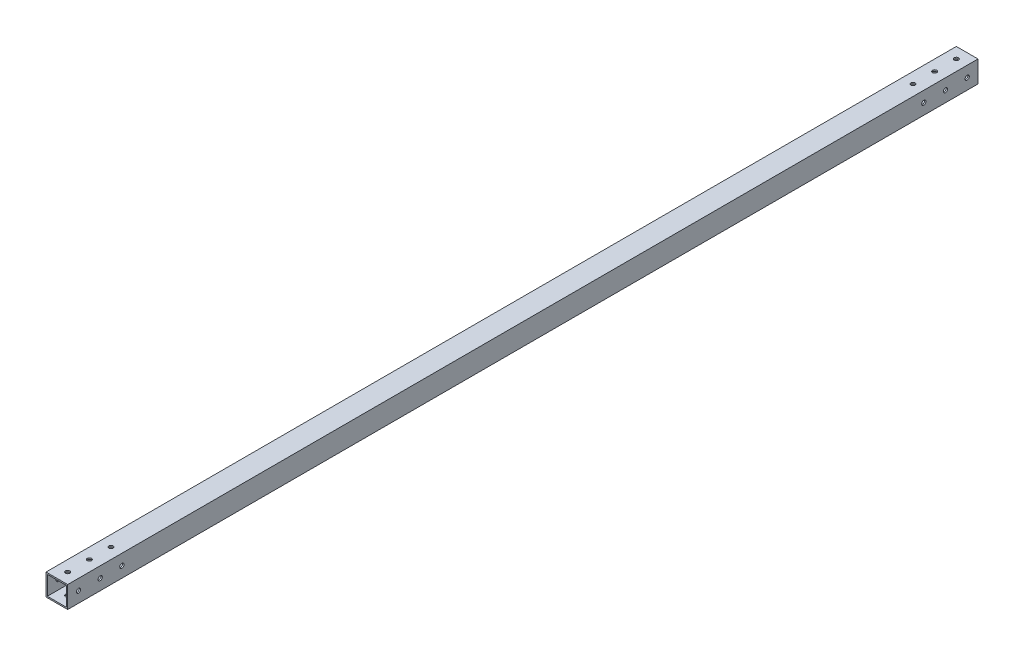
ISO-10303-21;
HEADER;
FILE_DESCRIPTION(('STEP AP214'),'2;1');
FILE_NAME('part.step','',(''),(''),'','','');
FILE_SCHEMA(('AUTOMOTIVE_DESIGN { 1 0 10303 214 1 1 1 1 }'));
ENDSEC;
DATA;
#1=APPLICATION_CONTEXT('core data for automotive mechanical design processes');
#2=APPLICATION_PROTOCOL_DEFINITION('international standard','automotive_design',2000,#1);
#3=PRODUCT_CONTEXT('',#1,'mechanical');
#4=PRODUCT('Part','Part','',(#3));
#5=PRODUCT_RELATED_PRODUCT_CATEGORY('part','',(#4));
#6=PRODUCT_DEFINITION_FORMATION('','',#4);
#7=PRODUCT_DEFINITION_CONTEXT('part definition',#1,'design');
#8=PRODUCT_DEFINITION('design','',#6,#7);
#9=PRODUCT_DEFINITION_SHAPE('','',#8);
#10=(LENGTH_UNIT() NAMED_UNIT(*) SI_UNIT(.MILLI.,.METRE.));
#11=(NAMED_UNIT(*) PLANE_ANGLE_UNIT() SI_UNIT($,.RADIAN.));
#12=(NAMED_UNIT(*) SI_UNIT($,.STERADIAN.) SOLID_ANGLE_UNIT());
#13=UNCERTAINTY_MEASURE_WITH_UNIT(LENGTH_MEASURE(1.E-05),#10,'distance_accuracy_value','');
#14=(GEOMETRIC_REPRESENTATION_CONTEXT(3) GLOBAL_UNCERTAINTY_ASSIGNED_CONTEXT((#13)) GLOBAL_UNIT_ASSIGNED_CONTEXT((#10,
#11,#12)) REPRESENTATION_CONTEXT('',''));
#15=CARTESIAN_POINT('',(0.,0.,0.));
#16=DIRECTION('',(0.,0.,1.));
#17=DIRECTION('',(1.,0.,0.));
#18=AXIS2_PLACEMENT_3D('',#15,#16,#17);
#19=CARTESIAN_POINT('',(0.,0.,533.4));
#20=DIRECTION('',(0.,0.,-1.));
#21=DIRECTION('',(-1.,0.,0.));
#22=AXIS2_PLACEMENT_3D('',#19,#20,#21);
#23=PLANE('',#22);
#24=DIRECTION('',(0.,-1.,0.));
#25=VECTOR('',#24,1.);
#26=CARTESIAN_POINT('',(0.,0.,533.4));
#27=LINE('',#26,#25);
#28=CARTESIAN_POINT('',(0.,25.4,533.4));
#29=VERTEX_POINT('',#28);
#30=CARTESIAN_POINT('',(0.,0.,533.4));
#31=VERTEX_POINT('',#30);
#32=EDGE_CURVE('E154',#29,#31,#27,.T.);
#33=ORIENTED_EDGE('',*,*,#32,.T.);
#34=DIRECTION('',(1.,0.,0.));
#35=VECTOR('',#34,1.);
#36=CARTESIAN_POINT('',(0.,0.,533.4));
#37=LINE('',#36,#35);
#38=CARTESIAN_POINT('',(25.4,0.,533.4));
#39=VERTEX_POINT('',#38);
#40=EDGE_CURVE('E158',#31,#39,#37,.T.);
#41=ORIENTED_EDGE('',*,*,#40,.T.);
#42=DIRECTION('',(0.,1.,0.));
#43=VECTOR('',#42,1.);
#44=CARTESIAN_POINT('',(25.4,0.,533.4));
#45=LINE('',#44,#43);
#46=CARTESIAN_POINT('',(25.4,25.4,533.4));
#47=VERTEX_POINT('',#46);
#48=EDGE_CURVE('E162',#39,#47,#45,.T.);
#49=ORIENTED_EDGE('',*,*,#48,.T.);
#50=DIRECTION('',(-1.,0.,0.));
#51=VECTOR('',#50,1.);
#52=CARTESIAN_POINT('',(0.,25.4,533.4));
#53=LINE('',#52,#51);
#54=EDGE_CURVE('E165',#47,#29,#53,.T.);
#55=ORIENTED_EDGE('',*,*,#54,.T.);
#56=EDGE_LOOP('',(#33,#41,#49,#55));
#57=FACE_BOUND('',#56,.T.);
#58=DIRECTION('',(0.,-1.,0.));
#59=VECTOR('',#58,1.);
#60=CARTESIAN_POINT('',(1.5875,0.,533.4));
#61=LINE('',#60,#59);
#62=CARTESIAN_POINT('',(1.5875,23.8125,533.4));
#63=VERTEX_POINT('',#62);
#64=CARTESIAN_POINT('',(1.5875,1.5875,533.4));
#65=VERTEX_POINT('',#64);
#66=EDGE_CURVE('E135',#63,#65,#61,.T.);
#67=ORIENTED_EDGE('',*,*,#66,.F.);
#68=DIRECTION('',(-1.,0.,0.));
#69=VECTOR('',#68,1.);
#70=CARTESIAN_POINT('',(0.,23.8125,533.4));
#71=LINE('',#70,#69);
#72=CARTESIAN_POINT('',(23.8125,23.8125,533.4));
#73=VERTEX_POINT('',#72);
#74=EDGE_CURVE('E116',#73,#63,#71,.T.);
#75=ORIENTED_EDGE('',*,*,#74,.F.);
#76=DIRECTION('',(0.,1.,0.));
#77=VECTOR('',#76,1.);
#78=CARTESIAN_POINT('',(23.8125,0.,533.4));
#79=LINE('',#78,#77);
#80=CARTESIAN_POINT('',(23.8125,1.5875,533.4));
#81=VERTEX_POINT('',#80);
#82=EDGE_CURVE('E149',#81,#73,#79,.T.);
#83=ORIENTED_EDGE('',*,*,#82,.F.);
#84=DIRECTION('',(1.,0.,0.));
#85=VECTOR('',#84,1.);
#86=CARTESIAN_POINT('',(0.,1.5875,533.4));
#87=LINE('',#86,#85);
#88=EDGE_CURVE('E140',#65,#81,#87,.T.);
#89=ORIENTED_EDGE('',*,*,#88,.F.);
#90=EDGE_LOOP('',(#67,#75,#83,#89));
#91=FACE_BOUND('',#90,.T.);
#92=ADVANCED_FACE('F43',(#57,#91),#23,.F.);
#93=CARTESIAN_POINT('',(0.,0.,-533.4));
#94=DIRECTION('',(0.,0.,-1.));
#95=DIRECTION('',(-1.,0.,0.));
#96=AXIS2_PLACEMENT_3D('',#93,#94,#95);
#97=PLANE('',#96);
#98=DIRECTION('',(0.,-1.,0.));
#99=VECTOR('',#98,1.);
#100=CARTESIAN_POINT('',(0.,0.,-533.4));
#101=LINE('',#100,#99);
#102=CARTESIAN_POINT('',(0.,25.4,-533.4));
#103=VERTEX_POINT('',#102);
#104=CARTESIAN_POINT('',(0.,0.,-533.4));
#105=VERTEX_POINT('',#104);
#106=EDGE_CURVE('E169',#103,#105,#101,.T.);
#107=ORIENTED_EDGE('',*,*,#106,.F.);
#108=DIRECTION('',(-1.,0.,0.));
#109=VECTOR('',#108,1.);
#110=CARTESIAN_POINT('',(0.,25.4,-533.4));
#111=LINE('',#110,#109);
#112=CARTESIAN_POINT('',(25.4,25.4,-533.4));
#113=VERTEX_POINT('',#112);
#114=EDGE_CURVE('E159',#113,#103,#111,.T.);
#115=ORIENTED_EDGE('',*,*,#114,.F.);
#116=DIRECTION('',(0.,1.,0.));
#117=VECTOR('',#116,1.);
#118=CARTESIAN_POINT('',(25.4,0.,-533.4));
#119=LINE('',#118,#117);
#120=CARTESIAN_POINT('',(25.4,0.,-533.4));
#121=VERTEX_POINT('',#120);
#122=EDGE_CURVE('E176',#121,#113,#119,.T.);
#123=ORIENTED_EDGE('',*,*,#122,.F.);
#124=DIRECTION('',(1.,0.,0.));
#125=VECTOR('',#124,1.);
#126=CARTESIAN_POINT('',(0.,0.,-533.4));
#127=LINE('',#126,#125);
#128=EDGE_CURVE('E173',#105,#121,#127,.T.);
#129=ORIENTED_EDGE('',*,*,#128,.F.);
#130=EDGE_LOOP('',(#107,#115,#123,#129));
#131=FACE_BOUND('',#130,.T.);
#132=DIRECTION('',(-1.,0.,0.));
#133=VECTOR('',#132,1.);
#134=CARTESIAN_POINT('',(0.,23.8125,-533.4));
#135=LINE('',#134,#133);
#136=CARTESIAN_POINT('',(23.8125,23.8125,-533.4));
#137=VERTEX_POINT('',#136);
#138=CARTESIAN_POINT('',(1.5875,23.8125,-533.4));
#139=VERTEX_POINT('',#138);
#140=EDGE_CURVE('E114',#137,#139,#135,.T.);
#141=ORIENTED_EDGE('',*,*,#140,.T.);
#142=DIRECTION('',(0.,-1.,0.));
#143=VECTOR('',#142,1.);
#144=CARTESIAN_POINT('',(1.5875,0.,-533.4));
#145=LINE('',#144,#143);
#146=CARTESIAN_POINT('',(1.5875,1.5875,-533.4));
#147=VERTEX_POINT('',#146);
#148=EDGE_CURVE('E123',#139,#147,#145,.T.);
#149=ORIENTED_EDGE('',*,*,#148,.T.);
#150=DIRECTION('',(1.,0.,0.));
#151=VECTOR('',#150,1.);
#152=CARTESIAN_POINT('',(0.,1.5875,-533.4));
#153=LINE('',#152,#151);
#154=CARTESIAN_POINT('',(23.8125,1.5875,-533.4));
#155=VERTEX_POINT('',#154);
#156=EDGE_CURVE('E130',#147,#155,#153,.T.);
#157=ORIENTED_EDGE('',*,*,#156,.T.);
#158=DIRECTION('',(0.,1.,0.));
#159=VECTOR('',#158,1.);
#160=CARTESIAN_POINT('',(23.8125,0.,-533.4));
#161=LINE('',#160,#159);
#162=EDGE_CURVE('E68',#155,#137,#161,.T.);
#163=ORIENTED_EDGE('',*,*,#162,.T.);
#164=EDGE_LOOP('',(#141,#149,#157,#163));
#165=FACE_BOUND('',#164,.T.);
#166=ADVANCED_FACE('F133',(#131,#165),#97,.T.);
#167=CARTESIAN_POINT('',(0.,0.,533.4));
#168=DIRECTION('',(1.,0.,0.));
#169=DIRECTION('',(0.,0.,-1.));
#170=AXIS2_PLACEMENT_3D('',#167,#168,#169);
#171=PLANE('',#170);
#172=CARTESIAN_POINT('',(0.,12.7,-520.7));
#173=DIRECTION('',(1.,0.,0.));
#174=DIRECTION('',(0.,0.,-1.));
#175=AXIS2_PLACEMENT_3D('',#172,#173,#174);
#176=CIRCLE('',#175,2.48919999999995);
#177=CARTESIAN_POINT('',(0.,12.7,-523.1892));
#178=VERTEX_POINT('',#177);
#179=EDGE_CURVE('E232',#178,#178,#176,.F.);
#180=ORIENTED_EDGE('',*,*,#179,.F.);
#181=EDGE_LOOP('',(#180));
#182=FACE_BOUND('',#181,.T.);
#183=CARTESIAN_POINT('',(0.,12.7,-495.3));
#184=DIRECTION('',(1.,0.,0.));
#185=DIRECTION('',(0.,0.,-1.));
#186=AXIS2_PLACEMENT_3D('',#183,#184,#185);
#187=CIRCLE('',#186,2.48920000000001);
#188=CARTESIAN_POINT('',(0.,12.7,-497.7892));
#189=VERTEX_POINT('',#188);
#190=EDGE_CURVE('E276',#189,#189,#187,.F.);
#191=ORIENTED_EDGE('',*,*,#190,.F.);
#192=EDGE_LOOP('',(#191));
#193=FACE_BOUND('',#192,.T.);
#194=CARTESIAN_POINT('',(0.,12.7,-469.9));
#195=DIRECTION('',(1.,0.,0.));
#196=DIRECTION('',(0.,0.,-1.));
#197=AXIS2_PLACEMENT_3D('',#194,#195,#196);
#198=CIRCLE('',#197,2.48920000000001);
#199=CARTESIAN_POINT('',(0.,12.7,-472.3892));
#200=VERTEX_POINT('',#199);
#201=EDGE_CURVE('E253',#200,#200,#198,.F.);
#202=ORIENTED_EDGE('',*,*,#201,.F.);
#203=EDGE_LOOP('',(#202));
#204=FACE_BOUND('',#203,.T.);
#205=CARTESIAN_POINT('',(0.,12.7,520.7));
#206=DIRECTION('',(1.,0.,0.));
#207=DIRECTION('',(0.,0.,-1.));
#208=AXIS2_PLACEMENT_3D('',#205,#206,#207);
#209=CIRCLE('',#208,2.48919999999995);
#210=CARTESIAN_POINT('',(0.,12.7,518.2108));
#211=VERTEX_POINT('',#210);
#212=EDGE_CURVE('E196',#211,#211,#209,.T.);
#213=ORIENTED_EDGE('',*,*,#212,.T.);
#214=EDGE_LOOP('',(#213));
#215=FACE_BOUND('',#214,.T.);
#216=CARTESIAN_POINT('',(0.,12.7,495.3));
#217=DIRECTION('',(1.,0.,0.));
#218=DIRECTION('',(0.,0.,-1.));
#219=AXIS2_PLACEMENT_3D('',#216,#217,#218);
#220=CIRCLE('',#219,2.48920000000001);
#221=CARTESIAN_POINT('',(0.,12.7,492.8108));
#222=VERTEX_POINT('',#221);
#223=EDGE_CURVE('E226',#222,#222,#220,.T.);
#224=ORIENTED_EDGE('',*,*,#223,.T.);
#225=EDGE_LOOP('',(#224));
#226=FACE_BOUND('',#225,.T.);
#227=CARTESIAN_POINT('',(0.,12.7,469.9));
#228=DIRECTION('',(1.,0.,0.));
#229=DIRECTION('',(0.,0.,-1.));
#230=AXIS2_PLACEMENT_3D('',#227,#228,#229);
#231=CIRCLE('',#230,2.48920000000001);
#232=CARTESIAN_POINT('',(0.,12.7,467.4108));
#233=VERTEX_POINT('',#232);
#234=EDGE_CURVE('E220',#233,#233,#231,.T.);
#235=ORIENTED_EDGE('',*,*,#234,.T.);
#236=EDGE_LOOP('',(#235));
#237=FACE_BOUND('',#236,.T.);
#238=ORIENTED_EDGE('',*,*,#106,.T.);
#239=DIRECTION('',(0.,0.,-1.));
#240=VECTOR('',#239,1.);
#241=CARTESIAN_POINT('',(0.,0.,533.4));
#242=LINE('',#241,#240);
#243=EDGE_CURVE('E11',#31,#105,#242,.T.);
#244=ORIENTED_EDGE('',*,*,#243,.F.);
#245=ORIENTED_EDGE('',*,*,#32,.F.);
#246=DIRECTION('',(0.,0.,-1.));
#247=VECTOR('',#246,1.);
#248=CARTESIAN_POINT('',(0.,25.4,533.4));
#249=LINE('',#248,#247);
#250=EDGE_CURVE('E168',#29,#103,#249,.T.);
#251=ORIENTED_EDGE('',*,*,#250,.T.);
#252=EDGE_LOOP('',(#238,#244,#245,#251));
#253=FACE_BOUND('',#252,.T.);
#254=ADVANCED_FACE('F45',(#182,#193,#204,#215,#226,#237,#253),#171,.F.);
#255=CARTESIAN_POINT('',(0.,0.,533.4));
#256=DIRECTION('',(0.,1.,0.));
#257=DIRECTION('',(0.,0.,1.));
#258=AXIS2_PLACEMENT_3D('',#255,#256,#257);
#259=PLANE('',#258);
#260=CARTESIAN_POINT('',(12.7,0.,-520.7));
#261=DIRECTION('',(0.,1.,0.));
#262=DIRECTION('',(0.,0.,1.));
#263=AXIS2_PLACEMENT_3D('',#260,#261,#262);
#264=CIRCLE('',#263,2.48919999999996);
#265=CARTESIAN_POINT('',(12.7,0.,-518.2108));
#266=VERTEX_POINT('',#265);
#267=EDGE_CURVE('E214',#266,#266,#264,.F.);
#268=ORIENTED_EDGE('',*,*,#267,.F.);
#269=EDGE_LOOP('',(#268));
#270=FACE_BOUND('',#269,.T.);
#271=CARTESIAN_POINT('',(12.7,0.,-495.3));
#272=DIRECTION('',(0.,1.,0.));
#273=DIRECTION('',(0.,0.,1.));
#274=AXIS2_PLACEMENT_3D('',#271,#272,#273);
#275=CIRCLE('',#274,2.4892);
#276=CARTESIAN_POINT('',(12.7,0.,-492.8108));
#277=VERTEX_POINT('',#276);
#278=EDGE_CURVE('E244',#277,#277,#275,.F.);
#279=ORIENTED_EDGE('',*,*,#278,.F.);
#280=EDGE_LOOP('',(#279));
#281=FACE_BOUND('',#280,.T.);
#282=CARTESIAN_POINT('',(12.7,0.,-469.9));
#283=DIRECTION('',(0.,1.,0.));
#284=DIRECTION('',(0.,0.,1.));
#285=AXIS2_PLACEMENT_3D('',#282,#283,#284);
#286=CIRCLE('',#285,2.48920000000001);
#287=CARTESIAN_POINT('',(12.7,0.,-467.4108));
#288=VERTEX_POINT('',#287);
#289=EDGE_CURVE('E238',#288,#288,#286,.F.);
#290=ORIENTED_EDGE('',*,*,#289,.F.);
#291=EDGE_LOOP('',(#290));
#292=FACE_BOUND('',#291,.T.);
#293=CARTESIAN_POINT('',(12.7,0.,520.7));
#294=DIRECTION('',(0.,1.,0.));
#295=DIRECTION('',(0.,0.,1.));
#296=AXIS2_PLACEMENT_3D('',#293,#294,#295);
#297=CIRCLE('',#296,2.48919999999996);
#298=CARTESIAN_POINT('',(12.7,0.,523.1892));
#299=VERTEX_POINT('',#298);
#300=EDGE_CURVE('E131',#299,#299,#297,.T.);
#301=ORIENTED_EDGE('',*,*,#300,.T.);
#302=EDGE_LOOP('',(#301));
#303=FACE_BOUND('',#302,.T.);
#304=CARTESIAN_POINT('',(12.7,0.,495.3));
#305=DIRECTION('',(0.,1.,0.));
#306=DIRECTION('',(0.,0.,1.));
#307=AXIS2_PLACEMENT_3D('',#304,#305,#306);
#308=CIRCLE('',#307,2.4892);
#309=CARTESIAN_POINT('',(12.7,0.,497.7892));
#310=VERTEX_POINT('',#309);
#311=EDGE_CURVE('E208',#310,#310,#308,.T.);
#312=ORIENTED_EDGE('',*,*,#311,.T.);
#313=EDGE_LOOP('',(#312));
#314=FACE_BOUND('',#313,.T.);
#315=CARTESIAN_POINT('',(12.7,0.,469.9));
#316=DIRECTION('',(0.,1.,0.));
#317=DIRECTION('',(0.,0.,1.));
#318=AXIS2_PLACEMENT_3D('',#315,#316,#317);
#319=CIRCLE('',#318,2.48920000000001);
#320=CARTESIAN_POINT('',(12.7,0.,472.3892));
#321=VERTEX_POINT('',#320);
#322=EDGE_CURVE('E202',#321,#321,#319,.T.);
#323=ORIENTED_EDGE('',*,*,#322,.T.);
#324=EDGE_LOOP('',(#323));
#325=FACE_BOUND('',#324,.T.);
#326=ORIENTED_EDGE('',*,*,#128,.T.);
#327=DIRECTION('',(0.,0.,-1.));
#328=VECTOR('',#327,1.);
#329=CARTESIAN_POINT('',(25.4,0.,533.4));
#330=LINE('',#329,#328);
#331=EDGE_CURVE('E53',#39,#121,#330,.T.);
#332=ORIENTED_EDGE('',*,*,#331,.F.);
#333=ORIENTED_EDGE('',*,*,#40,.F.);
#334=ORIENTED_EDGE('',*,*,#243,.T.);
#335=EDGE_LOOP('',(#326,#332,#333,#334));
#336=FACE_BOUND('',#335,.T.);
#337=ADVANCED_FACE('F421',(#270,#281,#292,#303,#314,#325,#336),#259,.F.);
#338=CARTESIAN_POINT('',(25.4,0.,533.4));
#339=DIRECTION('',(-1.,0.,0.));
#340=DIRECTION('',(0.,0.,1.));
#341=AXIS2_PLACEMENT_3D('',#338,#339,#340);
#342=PLANE('',#341);
#343=CARTESIAN_POINT('',(25.4,12.7,-520.7));
#344=DIRECTION('',(-1.,0.,0.));
#345=DIRECTION('',(0.,0.,1.));
#346=AXIS2_PLACEMENT_3D('',#343,#344,#345);
#347=CIRCLE('',#346,2.48919999999995);
#348=CARTESIAN_POINT('',(25.4,12.7,-518.2108));
#349=VERTEX_POINT('',#348);
#350=EDGE_CURVE('E284',#349,#349,#347,.F.);
#351=ORIENTED_EDGE('',*,*,#350,.F.);
#352=EDGE_LOOP('',(#351));
#353=FACE_BOUND('',#352,.T.);
#354=CARTESIAN_POINT('',(25.4,12.7,-495.3));
#355=DIRECTION('',(-1.,0.,0.));
#356=DIRECTION('',(0.,0.,1.));
#357=AXIS2_PLACEMENT_3D('',#354,#355,#356);
#358=CIRCLE('',#357,2.48920000000001);
#359=CARTESIAN_POINT('',(25.4,12.7,-492.8108));
#360=VERTEX_POINT('',#359);
#361=EDGE_CURVE('E260',#360,#360,#358,.F.);
#362=ORIENTED_EDGE('',*,*,#361,.F.);
#363=EDGE_LOOP('',(#362));
#364=FACE_BOUND('',#363,.T.);
#365=CARTESIAN_POINT('',(25.4,12.7,-469.9));
#366=DIRECTION('',(-1.,0.,0.));
#367=DIRECTION('',(0.,0.,1.));
#368=AXIS2_PLACEMENT_3D('',#365,#366,#367);
#369=CIRCLE('',#368,2.48920000000001);
#370=CARTESIAN_POINT('',(25.4,12.7,-467.4108));
#371=VERTEX_POINT('',#370);
#372=EDGE_CURVE('E263',#371,#371,#369,.F.);
#373=ORIENTED_EDGE('',*,*,#372,.F.);
#374=EDGE_LOOP('',(#373));
#375=FACE_BOUND('',#374,.T.);
#376=CARTESIAN_POINT('',(25.4,12.7,520.7));
#377=DIRECTION('',(-1.,0.,0.));
#378=DIRECTION('',(0.,0.,1.));
#379=AXIS2_PLACEMENT_3D('',#376,#377,#378);
#380=CIRCLE('',#379,2.48919999999995);
#381=CARTESIAN_POINT('',(25.4,12.7,523.1892));
#382=VERTEX_POINT('',#381);
#383=EDGE_CURVE('E344',#382,#382,#380,.T.);
#384=ORIENTED_EDGE('',*,*,#383,.T.);
#385=EDGE_LOOP('',(#384));
#386=FACE_BOUND('',#385,.T.);
#387=CARTESIAN_POINT('',(25.4,12.7,495.3));
#388=DIRECTION('',(-1.,0.,0.));
#389=DIRECTION('',(0.,0.,1.));
#390=AXIS2_PLACEMENT_3D('',#387,#388,#389);
#391=CIRCLE('',#390,2.48920000000001);
#392=CARTESIAN_POINT('',(25.4,12.7,497.7892));
#393=VERTEX_POINT('',#392);
#394=EDGE_CURVE('E334',#393,#393,#391,.T.);
#395=ORIENTED_EDGE('',*,*,#394,.T.);
#396=EDGE_LOOP('',(#395));
#397=FACE_BOUND('',#396,.T.);
#398=CARTESIAN_POINT('',(25.4,12.7,469.9));
#399=DIRECTION('',(-1.,0.,0.));
#400=DIRECTION('',(0.,0.,1.));
#401=AXIS2_PLACEMENT_3D('',#398,#399,#400);
#402=CIRCLE('',#401,2.48920000000001);
#403=CARTESIAN_POINT('',(25.4,12.7,472.3892));
#404=VERTEX_POINT('',#403);
#405=EDGE_CURVE('E324',#404,#404,#402,.T.);
#406=ORIENTED_EDGE('',*,*,#405,.T.);
#407=EDGE_LOOP('',(#406));
#408=FACE_BOUND('',#407,.T.);
#409=ORIENTED_EDGE('',*,*,#122,.T.);
#410=DIRECTION('',(0.,0.,-1.));
#411=VECTOR('',#410,1.);
#412=CARTESIAN_POINT('',(25.4,25.4,533.4));
#413=LINE('',#412,#411);
#414=EDGE_CURVE('E184',#47,#113,#413,.T.);
#415=ORIENTED_EDGE('',*,*,#414,.F.);
#416=ORIENTED_EDGE('',*,*,#48,.F.);
#417=ORIENTED_EDGE('',*,*,#331,.T.);
#418=EDGE_LOOP('',(#409,#415,#416,#417));
#419=FACE_BOUND('',#418,.T.);
#420=ADVANCED_FACE('F418',(#353,#364,#375,#386,#397,#408,#419),#342,.F.);
#421=CARTESIAN_POINT('',(0.,25.4,533.4));
#422=DIRECTION('',(0.,-1.,0.));
#423=DIRECTION('',(0.,0.,-1.));
#424=AXIS2_PLACEMENT_3D('',#421,#422,#423);
#425=PLANE('',#424);
#426=CARTESIAN_POINT('',(12.7,25.4,-520.7));
#427=DIRECTION('',(0.,-1.,0.));
#428=DIRECTION('',(0.,0.,-1.));
#429=AXIS2_PLACEMENT_3D('',#426,#427,#428);
#430=CIRCLE('',#429,2.48919999999996);
#431=CARTESIAN_POINT('',(12.7,25.4,-523.1892));
#432=VERTEX_POINT('',#431);
#433=EDGE_CURVE('E314',#432,#432,#430,.F.);
#434=ORIENTED_EDGE('',*,*,#433,.F.);
#435=EDGE_LOOP('',(#434));
#436=FACE_BOUND('',#435,.T.);
#437=CARTESIAN_POINT('',(12.7,25.4,-495.3));
#438=DIRECTION('',(0.,-1.,0.));
#439=DIRECTION('',(0.,0.,-1.));
#440=AXIS2_PLACEMENT_3D('',#437,#438,#439);
#441=CIRCLE('',#440,2.4892);
#442=CARTESIAN_POINT('',(12.7,25.4,-497.7892));
#443=VERTEX_POINT('',#442);
#444=EDGE_CURVE('E304',#443,#443,#441,.F.);
#445=ORIENTED_EDGE('',*,*,#444,.F.);
#446=EDGE_LOOP('',(#445));
#447=FACE_BOUND('',#446,.T.);
#448=CARTESIAN_POINT('',(12.7,25.4,-469.9));
#449=DIRECTION('',(0.,-1.,0.));
#450=DIRECTION('',(0.,0.,-1.));
#451=AXIS2_PLACEMENT_3D('',#448,#449,#450);
#452=CIRCLE('',#451,2.48920000000001);
#453=CARTESIAN_POINT('',(12.7,25.4,-472.3892));
#454=VERTEX_POINT('',#453);
#455=EDGE_CURVE('E294',#454,#454,#452,.F.);
#456=ORIENTED_EDGE('',*,*,#455,.F.);
#457=EDGE_LOOP('',(#456));
#458=FACE_BOUND('',#457,.T.);
#459=CARTESIAN_POINT('',(12.7,25.4,520.7));
#460=DIRECTION('',(0.,-1.,0.));
#461=DIRECTION('',(0.,0.,-1.));
#462=AXIS2_PLACEMENT_3D('',#459,#460,#461);
#463=CIRCLE('',#462,2.48919999999996);
#464=CARTESIAN_POINT('',(12.7,25.4,518.2108));
#465=VERTEX_POINT('',#464);
#466=EDGE_CURVE('E374',#465,#465,#463,.T.);
#467=ORIENTED_EDGE('',*,*,#466,.T.);
#468=EDGE_LOOP('',(#467));
#469=FACE_BOUND('',#468,.T.);
#470=CARTESIAN_POINT('',(12.7,25.4,495.3));
#471=DIRECTION('',(0.,-1.,0.));
#472=DIRECTION('',(0.,0.,-1.));
#473=AXIS2_PLACEMENT_3D('',#470,#471,#472);
#474=CIRCLE('',#473,2.4892);
#475=CARTESIAN_POINT('',(12.7,25.4,492.8108));
#476=VERTEX_POINT('',#475);
#477=EDGE_CURVE('E364',#476,#476,#474,.T.);
#478=ORIENTED_EDGE('',*,*,#477,.T.);
#479=EDGE_LOOP('',(#478));
#480=FACE_BOUND('',#479,.T.);
#481=CARTESIAN_POINT('',(12.7,25.4,469.9));
#482=DIRECTION('',(0.,-1.,0.));
#483=DIRECTION('',(0.,0.,-1.));
#484=AXIS2_PLACEMENT_3D('',#481,#482,#483);
#485=CIRCLE('',#484,2.48920000000001);
#486=CARTESIAN_POINT('',(12.7,25.4,467.4108));
#487=VERTEX_POINT('',#486);
#488=EDGE_CURVE('E354',#487,#487,#485,.T.);
#489=ORIENTED_EDGE('',*,*,#488,.T.);
#490=EDGE_LOOP('',(#489));
#491=FACE_BOUND('',#490,.T.);
#492=ORIENTED_EDGE('',*,*,#114,.T.);
#493=ORIENTED_EDGE('',*,*,#250,.F.);
#494=ORIENTED_EDGE('',*,*,#54,.F.);
#495=ORIENTED_EDGE('',*,*,#414,.T.);
#496=EDGE_LOOP('',(#492,#493,#494,#495));
#497=FACE_BOUND('',#496,.T.);
#498=ADVANCED_FACE('F402',(#436,#447,#458,#469,#480,#491,#497),#425,.F.);
#499=CARTESIAN_POINT('',(1.5875,0.,533.4));
#500=DIRECTION('',(1.,0.,0.));
#501=DIRECTION('',(0.,0.,-1.));
#502=AXIS2_PLACEMENT_3D('',#499,#500,#501);
#503=PLANE('',#502);
#504=CARTESIAN_POINT('',(1.58749999999996,12.7,-520.7));
#505=DIRECTION('',(1.,0.,0.));
#506=DIRECTION('',(0.,0.,-1.));
#507=AXIS2_PLACEMENT_3D('',#504,#505,#506);
#508=CIRCLE('',#507,2.48919999999995);
#509=CARTESIAN_POINT('',(1.58749999999996,12.7,-523.1892));
#510=VERTEX_POINT('',#509);
#511=EDGE_CURVE('E280',#510,#510,#508,.F.);
#512=ORIENTED_EDGE('',*,*,#511,.T.);
#513=EDGE_LOOP('',(#512));
#514=FACE_BOUND('',#513,.T.);
#515=CARTESIAN_POINT('',(1.58749999999996,12.7,-495.3));
#516=DIRECTION('',(1.,0.,0.));
#517=DIRECTION('',(0.,0.,-1.));
#518=AXIS2_PLACEMENT_3D('',#515,#516,#517);
#519=CIRCLE('',#518,2.48920000000001);
#520=CARTESIAN_POINT('',(1.58749999999996,12.7,-497.7892));
#521=VERTEX_POINT('',#520);
#522=EDGE_CURVE('E252',#521,#521,#519,.F.);
#523=ORIENTED_EDGE('',*,*,#522,.T.);
#524=EDGE_LOOP('',(#523));
#525=FACE_BOUND('',#524,.T.);
#526=CARTESIAN_POINT('',(1.58749999999996,12.7,-469.9));
#527=DIRECTION('',(1.,0.,0.));
#528=DIRECTION('',(0.,0.,-1.));
#529=AXIS2_PLACEMENT_3D('',#526,#527,#528);
#530=CIRCLE('',#529,2.48920000000001);
#531=CARTESIAN_POINT('',(1.58749999999996,12.7,-472.3892));
#532=VERTEX_POINT('',#531);
#533=EDGE_CURVE('E248',#532,#532,#530,.F.);
#534=ORIENTED_EDGE('',*,*,#533,.T.);
#535=EDGE_LOOP('',(#534));
#536=FACE_BOUND('',#535,.T.);
#537=CARTESIAN_POINT('',(1.58749999999996,12.7,520.7));
#538=DIRECTION('',(1.,0.,0.));
#539=DIRECTION('',(0.,0.,-1.));
#540=AXIS2_PLACEMENT_3D('',#537,#538,#539);
#541=CIRCLE('',#540,2.48919999999995);
#542=CARTESIAN_POINT('',(1.58749999999996,12.7,518.2108));
#543=VERTEX_POINT('',#542);
#544=EDGE_CURVE('E225',#543,#543,#541,.T.);
#545=ORIENTED_EDGE('',*,*,#544,.F.);
#546=EDGE_LOOP('',(#545));
#547=FACE_BOUND('',#546,.T.);
#548=CARTESIAN_POINT('',(1.58749999999996,12.7,495.3));
#549=DIRECTION('',(1.,0.,0.));
#550=DIRECTION('',(0.,0.,-1.));
#551=AXIS2_PLACEMENT_3D('',#548,#549,#550);
#552=CIRCLE('',#551,2.48920000000001);
#553=CARTESIAN_POINT('',(1.58749999999996,12.7,492.8108));
#554=VERTEX_POINT('',#553);
#555=EDGE_CURVE('E219',#554,#554,#552,.T.);
#556=ORIENTED_EDGE('',*,*,#555,.F.);
#557=EDGE_LOOP('',(#556));
#558=FACE_BOUND('',#557,.T.);
#559=CARTESIAN_POINT('',(1.58749999999996,12.7,469.9));
#560=DIRECTION('',(1.,0.,0.));
#561=DIRECTION('',(0.,0.,-1.));
#562=AXIS2_PLACEMENT_3D('',#559,#560,#561);
#563=CIRCLE('',#562,2.48920000000001);
#564=CARTESIAN_POINT('',(1.58749999999996,12.7,467.4108));
#565=VERTEX_POINT('',#564);
#566=EDGE_CURVE('E213',#565,#565,#563,.T.);
#567=ORIENTED_EDGE('',*,*,#566,.F.);
#568=EDGE_LOOP('',(#567));
#569=FACE_BOUND('',#568,.T.);
#570=ORIENTED_EDGE('',*,*,#148,.F.);
#571=DIRECTION('',(0.,0.,-1.));
#572=VECTOR('',#571,1.);
#573=CARTESIAN_POINT('',(1.5875,23.8125,533.4));
#574=LINE('',#573,#572);
#575=EDGE_CURVE('E110',#63,#139,#574,.T.);
#576=ORIENTED_EDGE('',*,*,#575,.F.);
#577=ORIENTED_EDGE('',*,*,#66,.T.);
#578=DIRECTION('',(0.,0.,-1.));
#579=VECTOR('',#578,1.);
#580=CARTESIAN_POINT('',(1.5875,1.5875,533.4));
#581=LINE('',#580,#579);
#582=EDGE_CURVE('E126',#65,#147,#581,.T.);
#583=ORIENTED_EDGE('',*,*,#582,.T.);
#584=EDGE_LOOP('',(#570,#576,#577,#583));
#585=FACE_BOUND('',#584,.T.);
#586=ADVANCED_FACE('F124',(#514,#525,#536,#547,#558,#569,#585),#503,.T.);
#587=CARTESIAN_POINT('',(0.,1.5875,533.4));
#588=DIRECTION('',(0.,1.,0.));
#589=DIRECTION('',(0.,0.,1.));
#590=AXIS2_PLACEMENT_3D('',#587,#588,#589);
#591=PLANE('',#590);
#592=CARTESIAN_POINT('',(12.7,1.58749999999996,-520.7));
#593=DIRECTION('',(0.,1.,0.));
#594=DIRECTION('',(0.,0.,1.));
#595=AXIS2_PLACEMENT_3D('',#592,#593,#594);
#596=CIRCLE('',#595,2.48919999999996);
#597=CARTESIAN_POINT('',(12.7,1.58749999999996,-518.2108));
#598=VERTEX_POINT('',#597);
#599=EDGE_CURVE('E243',#598,#598,#596,.F.);
#600=ORIENTED_EDGE('',*,*,#599,.T.);
#601=EDGE_LOOP('',(#600));
#602=FACE_BOUND('',#601,.T.);
#603=CARTESIAN_POINT('',(12.7,1.58749999999996,-495.3));
#604=DIRECTION('',(0.,1.,0.));
#605=DIRECTION('',(0.,0.,1.));
#606=AXIS2_PLACEMENT_3D('',#603,#604,#605);
#607=CIRCLE('',#606,2.4892);
#608=CARTESIAN_POINT('',(12.7,1.58749999999996,-492.8108));
#609=VERTEX_POINT('',#608);
#610=EDGE_CURVE('E237',#609,#609,#607,.F.);
#611=ORIENTED_EDGE('',*,*,#610,.T.);
#612=EDGE_LOOP('',(#611));
#613=FACE_BOUND('',#612,.T.);
#614=CARTESIAN_POINT('',(12.7,1.58749999999996,-469.9));
#615=DIRECTION('',(0.,1.,0.));
#616=DIRECTION('',(0.,0.,1.));
#617=AXIS2_PLACEMENT_3D('',#614,#615,#616);
#618=CIRCLE('',#617,2.48920000000001);
#619=CARTESIAN_POINT('',(12.7,1.58749999999996,-467.4108));
#620=VERTEX_POINT('',#619);
#621=EDGE_CURVE('E231',#620,#620,#618,.F.);
#622=ORIENTED_EDGE('',*,*,#621,.T.);
#623=EDGE_LOOP('',(#622));
#624=FACE_BOUND('',#623,.T.);
#625=CARTESIAN_POINT('',(12.7,1.58749999999996,520.7));
#626=DIRECTION('',(0.,1.,0.));
#627=DIRECTION('',(0.,0.,1.));
#628=AXIS2_PLACEMENT_3D('',#625,#626,#627);
#629=CIRCLE('',#628,2.48919999999996);
#630=CARTESIAN_POINT('',(12.7,1.58749999999996,523.1892));
#631=VERTEX_POINT('',#630);
#632=EDGE_CURVE('E207',#631,#631,#629,.T.);
#633=ORIENTED_EDGE('',*,*,#632,.F.);
#634=EDGE_LOOP('',(#633));
#635=FACE_BOUND('',#634,.T.);
#636=CARTESIAN_POINT('',(12.7,1.58749999999996,495.3));
#637=DIRECTION('',(0.,1.,0.));
#638=DIRECTION('',(0.,0.,1.));
#639=AXIS2_PLACEMENT_3D('',#636,#637,#638);
#640=CIRCLE('',#639,2.4892);
#641=CARTESIAN_POINT('',(12.7,1.58749999999996,497.7892));
#642=VERTEX_POINT('',#641);
#643=EDGE_CURVE('E201',#642,#642,#640,.T.);
#644=ORIENTED_EDGE('',*,*,#643,.F.);
#645=EDGE_LOOP('',(#644));
#646=FACE_BOUND('',#645,.T.);
#647=CARTESIAN_POINT('',(12.7,1.58749999999996,469.9));
#648=DIRECTION('',(0.,1.,0.));
#649=DIRECTION('',(0.,0.,1.));
#650=AXIS2_PLACEMENT_3D('',#647,#648,#649);
#651=CIRCLE('',#650,2.48920000000001);
#652=CARTESIAN_POINT('',(12.7,1.58749999999996,472.3892));
#653=VERTEX_POINT('',#652);
#654=EDGE_CURVE('E195',#653,#653,#651,.T.);
#655=ORIENTED_EDGE('',*,*,#654,.F.);
#656=EDGE_LOOP('',(#655));
#657=FACE_BOUND('',#656,.T.);
#658=ORIENTED_EDGE('',*,*,#156,.F.);
#659=ORIENTED_EDGE('',*,*,#582,.F.);
#660=ORIENTED_EDGE('',*,*,#88,.T.);
#661=DIRECTION('',(0.,0.,-1.));
#662=VECTOR('',#661,1.);
#663=CARTESIAN_POINT('',(23.8125,1.5875,533.4));
#664=LINE('',#663,#662);
#665=EDGE_CURVE('E382',#81,#155,#664,.T.);
#666=ORIENTED_EDGE('',*,*,#665,.T.);
#667=EDGE_LOOP('',(#658,#659,#660,#666));
#668=FACE_BOUND('',#667,.T.);
#669=ADVANCED_FACE('F392',(#602,#613,#624,#635,#646,#657,#668),#591,.T.);
#670=CARTESIAN_POINT('',(23.8125,0.,533.4));
#671=DIRECTION('',(-1.,0.,0.));
#672=DIRECTION('',(0.,0.,1.));
#673=AXIS2_PLACEMENT_3D('',#670,#671,#672);
#674=PLANE('',#673);
#675=CARTESIAN_POINT('',(23.8125,12.7,-520.7));
#676=DIRECTION('',(-1.,0.,0.));
#677=DIRECTION('',(0.,0.,1.));
#678=AXIS2_PLACEMENT_3D('',#675,#676,#677);
#679=CIRCLE('',#678,2.48919999999995);
#680=CARTESIAN_POINT('',(23.8125,12.7,-518.2108));
#681=VERTEX_POINT('',#680);
#682=EDGE_CURVE('E47',#681,#681,#679,.F.);
#683=ORIENTED_EDGE('',*,*,#682,.T.);
#684=EDGE_LOOP('',(#683));
#685=FACE_BOUND('',#684,.T.);
#686=CARTESIAN_POINT('',(23.8125,12.7,-495.3));
#687=DIRECTION('',(-1.,0.,0.));
#688=DIRECTION('',(0.,0.,1.));
#689=AXIS2_PLACEMENT_3D('',#686,#687,#688);
#690=CIRCLE('',#689,2.48920000000001);
#691=CARTESIAN_POINT('',(23.8125,12.7,-492.8108));
#692=VERTEX_POINT('',#691);
#693=EDGE_CURVE('E249',#692,#692,#690,.F.);
#694=ORIENTED_EDGE('',*,*,#693,.T.);
#695=EDGE_LOOP('',(#694));
#696=FACE_BOUND('',#695,.T.);
#697=CARTESIAN_POINT('',(23.8125,12.7,-469.9));
#698=DIRECTION('',(-1.,0.,0.));
#699=DIRECTION('',(0.,0.,1.));
#700=AXIS2_PLACEMENT_3D('',#697,#698,#699);
#701=CIRCLE('',#700,2.48920000000001);
#702=CARTESIAN_POINT('',(23.8125,12.7,-467.4108));
#703=VERTEX_POINT('',#702);
#704=EDGE_CURVE('E245',#703,#703,#701,.F.);
#705=ORIENTED_EDGE('',*,*,#704,.T.);
#706=EDGE_LOOP('',(#705));
#707=FACE_BOUND('',#706,.T.);
#708=CARTESIAN_POINT('',(23.8125,12.7,520.7));
#709=DIRECTION('',(-1.,0.,0.));
#710=DIRECTION('',(0.,0.,1.));
#711=AXIS2_PLACEMENT_3D('',#708,#709,#710);
#712=CIRCLE('',#711,2.48919999999995);
#713=CARTESIAN_POINT('',(23.8125,12.7,523.1892));
#714=VERTEX_POINT('',#713);
#715=EDGE_CURVE('E221',#714,#714,#712,.T.);
#716=ORIENTED_EDGE('',*,*,#715,.F.);
#717=EDGE_LOOP('',(#716));
#718=FACE_BOUND('',#717,.T.);
#719=CARTESIAN_POINT('',(23.8125,12.7,495.3));
#720=DIRECTION('',(-1.,0.,0.));
#721=DIRECTION('',(0.,0.,1.));
#722=AXIS2_PLACEMENT_3D('',#719,#720,#721);
#723=CIRCLE('',#722,2.48920000000001);
#724=CARTESIAN_POINT('',(23.8125,12.7,497.7892));
#725=VERTEX_POINT('',#724);
#726=EDGE_CURVE('E215',#725,#725,#723,.T.);
#727=ORIENTED_EDGE('',*,*,#726,.F.);
#728=EDGE_LOOP('',(#727));
#729=FACE_BOUND('',#728,.T.);
#730=CARTESIAN_POINT('',(23.8125,12.7,469.9));
#731=DIRECTION('',(-1.,0.,0.));
#732=DIRECTION('',(0.,0.,1.));
#733=AXIS2_PLACEMENT_3D('',#730,#731,#732);
#734=CIRCLE('',#733,2.48920000000001);
#735=CARTESIAN_POINT('',(23.8125,12.7,472.3892));
#736=VERTEX_POINT('',#735);
#737=EDGE_CURVE('E209',#736,#736,#734,.T.);
#738=ORIENTED_EDGE('',*,*,#737,.F.);
#739=EDGE_LOOP('',(#738));
#740=FACE_BOUND('',#739,.T.);
#741=ORIENTED_EDGE('',*,*,#162,.F.);
#742=ORIENTED_EDGE('',*,*,#665,.F.);
#743=ORIENTED_EDGE('',*,*,#82,.T.);
#744=DIRECTION('',(0.,0.,-1.));
#745=VECTOR('',#744,1.);
#746=CARTESIAN_POINT('',(23.8125,23.8125,533.4));
#747=LINE('',#746,#745);
#748=EDGE_CURVE('E61',#73,#137,#747,.T.);
#749=ORIENTED_EDGE('',*,*,#748,.T.);
#750=EDGE_LOOP('',(#741,#742,#743,#749));
#751=FACE_BOUND('',#750,.T.);
#752=ADVANCED_FACE('F387',(#685,#696,#707,#718,#729,#740,#751),#674,.T.);
#753=CARTESIAN_POINT('',(0.,23.8125,533.4));
#754=DIRECTION('',(0.,-1.,0.));
#755=DIRECTION('',(0.,0.,-1.));
#756=AXIS2_PLACEMENT_3D('',#753,#754,#755);
#757=PLANE('',#756);
#758=CARTESIAN_POINT('',(12.7,23.8125,-520.7));
#759=DIRECTION('',(0.,-1.,0.));
#760=DIRECTION('',(0.,0.,-1.));
#761=AXIS2_PLACEMENT_3D('',#758,#759,#760);
#762=CIRCLE('',#761,2.48919999999996);
#763=CARTESIAN_POINT('',(12.7,23.8125,-523.1892));
#764=VERTEX_POINT('',#763);
#765=EDGE_CURVE('E239',#764,#764,#762,.F.);
#766=ORIENTED_EDGE('',*,*,#765,.T.);
#767=EDGE_LOOP('',(#766));
#768=FACE_BOUND('',#767,.T.);
#769=CARTESIAN_POINT('',(12.7,23.8125,-495.3));
#770=DIRECTION('',(0.,-1.,0.));
#771=DIRECTION('',(0.,0.,-1.));
#772=AXIS2_PLACEMENT_3D('',#769,#770,#771);
#773=CIRCLE('',#772,2.4892);
#774=CARTESIAN_POINT('',(12.7,23.8125,-497.7892));
#775=VERTEX_POINT('',#774);
#776=EDGE_CURVE('E233',#775,#775,#773,.F.);
#777=ORIENTED_EDGE('',*,*,#776,.T.);
#778=EDGE_LOOP('',(#777));
#779=FACE_BOUND('',#778,.T.);
#780=CARTESIAN_POINT('',(12.7,23.8125,-469.9));
#781=DIRECTION('',(0.,-1.,0.));
#782=DIRECTION('',(0.,0.,-1.));
#783=AXIS2_PLACEMENT_3D('',#780,#781,#782);
#784=CIRCLE('',#783,2.48920000000001);
#785=CARTESIAN_POINT('',(12.7,23.8125,-472.3892));
#786=VERTEX_POINT('',#785);
#787=EDGE_CURVE('E227',#786,#786,#784,.F.);
#788=ORIENTED_EDGE('',*,*,#787,.T.);
#789=EDGE_LOOP('',(#788));
#790=FACE_BOUND('',#789,.T.);
#791=CARTESIAN_POINT('',(12.7,23.8125,520.7));
#792=DIRECTION('',(0.,-1.,0.));
#793=DIRECTION('',(0.,0.,-1.));
#794=AXIS2_PLACEMENT_3D('',#791,#792,#793);
#795=CIRCLE('',#794,2.48919999999996);
#796=CARTESIAN_POINT('',(12.7,23.8125,518.2108));
#797=VERTEX_POINT('',#796);
#798=EDGE_CURVE('E203',#797,#797,#795,.T.);
#799=ORIENTED_EDGE('',*,*,#798,.F.);
#800=EDGE_LOOP('',(#799));
#801=FACE_BOUND('',#800,.T.);
#802=CARTESIAN_POINT('',(12.7,23.8125,495.3));
#803=DIRECTION('',(0.,-1.,0.));
#804=DIRECTION('',(0.,0.,-1.));
#805=AXIS2_PLACEMENT_3D('',#802,#803,#804);
#806=CIRCLE('',#805,2.4892);
#807=CARTESIAN_POINT('',(12.7,23.8125,492.8108));
#808=VERTEX_POINT('',#807);
#809=EDGE_CURVE('E197',#808,#808,#806,.T.);
#810=ORIENTED_EDGE('',*,*,#809,.F.);
#811=EDGE_LOOP('',(#810));
#812=FACE_BOUND('',#811,.T.);
#813=CARTESIAN_POINT('',(12.7,23.8125,469.9));
#814=DIRECTION('',(0.,-1.,0.));
#815=DIRECTION('',(0.,0.,-1.));
#816=AXIS2_PLACEMENT_3D('',#813,#814,#815);
#817=CIRCLE('',#816,2.48920000000001);
#818=CARTESIAN_POINT('',(12.7,23.8125,467.4108));
#819=VERTEX_POINT('',#818);
#820=EDGE_CURVE('E191',#819,#819,#817,.T.);
#821=ORIENTED_EDGE('',*,*,#820,.F.);
#822=EDGE_LOOP('',(#821));
#823=FACE_BOUND('',#822,.T.);
#824=ORIENTED_EDGE('',*,*,#140,.F.);
#825=ORIENTED_EDGE('',*,*,#748,.F.);
#826=ORIENTED_EDGE('',*,*,#74,.T.);
#827=ORIENTED_EDGE('',*,*,#575,.T.);
#828=EDGE_LOOP('',(#824,#825,#826,#827));
#829=FACE_BOUND('',#828,.T.);
#830=ADVANCED_FACE('F112',(#768,#779,#790,#801,#812,#823,#829),#757,.T.);
#831=CARTESIAN_POINT('',(12.7,-508.,469.9));
#832=DIRECTION('',(0.,1.,0.));
#833=DIRECTION('',(0.,0.,1.));
#834=AXIS2_PLACEMENT_3D('',#831,#832,#833);
#835=CYLINDRICAL_SURFACE('',#834,2.48920000000001);
#836=ORIENTED_EDGE('',*,*,#820,.T.);
#837=EDGE_LOOP('',(#836));
#838=FACE_BOUND('',#837,.T.);
#839=ORIENTED_EDGE('',*,*,#488,.F.);
#840=EDGE_LOOP('',(#839));
#841=FACE_BOUND('',#840,.T.);
#842=ADVANCED_FACE('F461',(#838,#841),#835,.F.);
#843=CARTESIAN_POINT('',(12.7,-508.,495.3));
#844=DIRECTION('',(0.,1.,0.));
#845=DIRECTION('',(0.,0.,1.));
#846=AXIS2_PLACEMENT_3D('',#843,#844,#845);
#847=CYLINDRICAL_SURFACE('',#846,2.4892);
#848=ORIENTED_EDGE('',*,*,#809,.T.);
#849=EDGE_LOOP('',(#848));
#850=FACE_BOUND('',#849,.T.);
#851=ORIENTED_EDGE('',*,*,#477,.F.);
#852=EDGE_LOOP('',(#851));
#853=FACE_BOUND('',#852,.T.);
#854=ADVANCED_FACE('F469',(#850,#853),#847,.F.);
#855=CARTESIAN_POINT('',(12.7,-508.,520.7));
#856=DIRECTION('',(0.,1.,0.));
#857=DIRECTION('',(0.,0.,1.));
#858=AXIS2_PLACEMENT_3D('',#855,#856,#857);
#859=CYLINDRICAL_SURFACE('',#858,2.48919999999996);
#860=ORIENTED_EDGE('',*,*,#798,.T.);
#861=EDGE_LOOP('',(#860));
#862=FACE_BOUND('',#861,.T.);
#863=ORIENTED_EDGE('',*,*,#466,.F.);
#864=EDGE_LOOP('',(#863));
#865=FACE_BOUND('',#864,.T.);
#866=ADVANCED_FACE('F458',(#862,#865),#859,.F.);
#867=ORIENTED_EDGE('',*,*,#654,.T.);
#868=EDGE_LOOP('',(#867));
#869=FACE_BOUND('',#868,.T.);
#870=ORIENTED_EDGE('',*,*,#322,.F.);
#871=EDGE_LOOP('',(#870));
#872=FACE_BOUND('',#871,.T.);
#873=ADVANCED_FACE('F455',(#869,#872),#835,.F.);
#874=ORIENTED_EDGE('',*,*,#643,.T.);
#875=EDGE_LOOP('',(#874));
#876=FACE_BOUND('',#875,.T.);
#877=ORIENTED_EDGE('',*,*,#311,.F.);
#878=EDGE_LOOP('',(#877));
#879=FACE_BOUND('',#878,.T.);
#880=ADVANCED_FACE('F457',(#876,#879),#847,.F.);
#881=ORIENTED_EDGE('',*,*,#632,.T.);
#882=EDGE_LOOP('',(#881));
#883=FACE_BOUND('',#882,.T.);
#884=ORIENTED_EDGE('',*,*,#300,.F.);
#885=EDGE_LOOP('',(#884));
#886=FACE_BOUND('',#885,.T.);
#887=ADVANCED_FACE('F466',(#883,#886),#859,.F.);
#888=CARTESIAN_POINT('',(533.4,12.7,469.9));
#889=DIRECTION('',(-1.,0.,0.));
#890=DIRECTION('',(0.,0.,1.));
#891=AXIS2_PLACEMENT_3D('',#888,#889,#890);
#892=CYLINDRICAL_SURFACE('',#891,2.48920000000001);
#893=ORIENTED_EDGE('',*,*,#737,.T.);
#894=EDGE_LOOP('',(#893));
#895=FACE_BOUND('',#894,.T.);
#896=ORIENTED_EDGE('',*,*,#405,.F.);
#897=EDGE_LOOP('',(#896));
#898=FACE_BOUND('',#897,.T.);
#899=ADVANCED_FACE('F547',(#895,#898),#892,.F.);
#900=CARTESIAN_POINT('',(533.4,12.7,495.3));
#901=DIRECTION('',(-1.,0.,0.));
#902=DIRECTION('',(0.,0.,1.));
#903=AXIS2_PLACEMENT_3D('',#900,#901,#902);
#904=CYLINDRICAL_SURFACE('',#903,2.48920000000001);
#905=ORIENTED_EDGE('',*,*,#726,.T.);
#906=EDGE_LOOP('',(#905));
#907=FACE_BOUND('',#906,.T.);
#908=ORIENTED_EDGE('',*,*,#394,.F.);
#909=EDGE_LOOP('',(#908));
#910=FACE_BOUND('',#909,.T.);
#911=ADVANCED_FACE('F551',(#907,#910),#904,.F.);
#912=CARTESIAN_POINT('',(533.4,12.7,520.7));
#913=DIRECTION('',(-1.,0.,0.));
#914=DIRECTION('',(0.,0.,1.));
#915=AXIS2_PLACEMENT_3D('',#912,#913,#914);
#916=CYLINDRICAL_SURFACE('',#915,2.48919999999995);
#917=ORIENTED_EDGE('',*,*,#715,.T.);
#918=EDGE_LOOP('',(#917));
#919=FACE_BOUND('',#918,.T.);
#920=ORIENTED_EDGE('',*,*,#383,.F.);
#921=EDGE_LOOP('',(#920));
#922=FACE_BOUND('',#921,.T.);
#923=ADVANCED_FACE('F523',(#919,#922),#916,.F.);
#924=ORIENTED_EDGE('',*,*,#566,.T.);
#925=EDGE_LOOP('',(#924));
#926=FACE_BOUND('',#925,.T.);
#927=ORIENTED_EDGE('',*,*,#234,.F.);
#928=EDGE_LOOP('',(#927));
#929=FACE_BOUND('',#928,.T.);
#930=ADVANCED_FACE('F554',(#926,#929),#892,.F.);
#931=ORIENTED_EDGE('',*,*,#555,.T.);
#932=EDGE_LOOP('',(#931));
#933=FACE_BOUND('',#932,.T.);
#934=ORIENTED_EDGE('',*,*,#223,.F.);
#935=EDGE_LOOP('',(#934));
#936=FACE_BOUND('',#935,.T.);
#937=ADVANCED_FACE('F520',(#933,#936),#904,.F.);
#938=ORIENTED_EDGE('',*,*,#544,.T.);
#939=EDGE_LOOP('',(#938));
#940=FACE_BOUND('',#939,.T.);
#941=ORIENTED_EDGE('',*,*,#212,.F.);
#942=EDGE_LOOP('',(#941));
#943=FACE_BOUND('',#942,.T.);
#944=ADVANCED_FACE('F507',(#940,#943),#916,.F.);
#945=CARTESIAN_POINT('',(12.7,-508.,-469.9));
#946=DIRECTION('',(0.,1.,0.));
#947=DIRECTION('',(0.,0.,1.));
#948=AXIS2_PLACEMENT_3D('',#945,#946,#947);
#949=CYLINDRICAL_SURFACE('',#948,2.48920000000001);
#950=ORIENTED_EDGE('',*,*,#787,.F.);
#951=EDGE_LOOP('',(#950));
#952=FACE_BOUND('',#951,.T.);
#953=ORIENTED_EDGE('',*,*,#455,.T.);
#954=EDGE_LOOP('',(#953));
#955=FACE_BOUND('',#954,.T.);
#956=ADVANCED_FACE('F503',(#952,#955),#949,.F.);
#957=CARTESIAN_POINT('',(12.7,-508.,-495.3));
#958=DIRECTION('',(0.,1.,0.));
#959=DIRECTION('',(0.,0.,1.));
#960=AXIS2_PLACEMENT_3D('',#957,#958,#959);
#961=CYLINDRICAL_SURFACE('',#960,2.4892);
#962=ORIENTED_EDGE('',*,*,#776,.F.);
#963=EDGE_LOOP('',(#962));
#964=FACE_BOUND('',#963,.T.);
#965=ORIENTED_EDGE('',*,*,#444,.T.);
#966=EDGE_LOOP('',(#965));
#967=FACE_BOUND('',#966,.T.);
#968=ADVANCED_FACE('F506',(#964,#967),#961,.F.);
#969=CARTESIAN_POINT('',(12.7,-508.,-520.7));
#970=DIRECTION('',(0.,1.,0.));
#971=DIRECTION('',(0.,0.,1.));
#972=AXIS2_PLACEMENT_3D('',#969,#970,#971);
#973=CYLINDRICAL_SURFACE('',#972,2.48919999999996);
#974=ORIENTED_EDGE('',*,*,#765,.F.);
#975=EDGE_LOOP('',(#974));
#976=FACE_BOUND('',#975,.T.);
#977=ORIENTED_EDGE('',*,*,#433,.T.);
#978=EDGE_LOOP('',(#977));
#979=FACE_BOUND('',#978,.T.);
#980=ADVANCED_FACE('F516',(#976,#979),#973,.F.);
#981=ORIENTED_EDGE('',*,*,#621,.F.);
#982=EDGE_LOOP('',(#981));
#983=FACE_BOUND('',#982,.T.);
#984=ORIENTED_EDGE('',*,*,#289,.T.);
#985=EDGE_LOOP('',(#984));
#986=FACE_BOUND('',#985,.T.);
#987=ADVANCED_FACE('F509',(#983,#986),#949,.F.);
#988=ORIENTED_EDGE('',*,*,#610,.F.);
#989=EDGE_LOOP('',(#988));
#990=FACE_BOUND('',#989,.T.);
#991=ORIENTED_EDGE('',*,*,#278,.T.);
#992=EDGE_LOOP('',(#991));
#993=FACE_BOUND('',#992,.T.);
#994=ADVANCED_FACE('F519',(#990,#993),#961,.F.);
#995=ORIENTED_EDGE('',*,*,#599,.F.);
#996=EDGE_LOOP('',(#995));
#997=FACE_BOUND('',#996,.T.);
#998=ORIENTED_EDGE('',*,*,#267,.T.);
#999=EDGE_LOOP('',(#998));
#1000=FACE_BOUND('',#999,.T.);
#1001=ADVANCED_FACE('F530',(#997,#1000),#973,.F.);
#1002=CARTESIAN_POINT('',(533.4,12.7,-469.9));
#1003=DIRECTION('',(-1.,0.,0.));
#1004=DIRECTION('',(0.,0.,1.));
#1005=AXIS2_PLACEMENT_3D('',#1002,#1003,#1004);
#1006=CYLINDRICAL_SURFACE('',#1005,2.48920000000001);
#1007=ORIENTED_EDGE('',*,*,#704,.F.);
#1008=EDGE_LOOP('',(#1007));
#1009=FACE_BOUND('',#1008,.T.);
#1010=ORIENTED_EDGE('',*,*,#372,.T.);
#1011=EDGE_LOOP('',(#1010));
#1012=FACE_BOUND('',#1011,.T.);
#1013=ADVANCED_FACE('F637',(#1009,#1012),#1006,.F.);
#1014=CARTESIAN_POINT('',(533.4,12.7,-495.3));
#1015=DIRECTION('',(-1.,0.,0.));
#1016=DIRECTION('',(0.,0.,1.));
#1017=AXIS2_PLACEMENT_3D('',#1014,#1015,#1016);
#1018=CYLINDRICAL_SURFACE('',#1017,2.48920000000001);
#1019=ORIENTED_EDGE('',*,*,#693,.F.);
#1020=EDGE_LOOP('',(#1019));
#1021=FACE_BOUND('',#1020,.T.);
#1022=ORIENTED_EDGE('',*,*,#361,.T.);
#1023=EDGE_LOOP('',(#1022));
#1024=FACE_BOUND('',#1023,.T.);
#1025=ADVANCED_FACE('F646',(#1021,#1024),#1018,.F.);
#1026=CARTESIAN_POINT('',(533.4,12.7,-520.7));
#1027=DIRECTION('',(-1.,0.,0.));
#1028=DIRECTION('',(0.,0.,1.));
#1029=AXIS2_PLACEMENT_3D('',#1026,#1027,#1028);
#1030=CYLINDRICAL_SURFACE('',#1029,2.48919999999995);
#1031=ORIENTED_EDGE('',*,*,#682,.F.);
#1032=EDGE_LOOP('',(#1031));
#1033=FACE_BOUND('',#1032,.T.);
#1034=ORIENTED_EDGE('',*,*,#350,.T.);
#1035=EDGE_LOOP('',(#1034));
#1036=FACE_BOUND('',#1035,.T.);
#1037=ADVANCED_FACE('F657',(#1033,#1036),#1030,.F.);
#1038=ORIENTED_EDGE('',*,*,#533,.F.);
#1039=EDGE_LOOP('',(#1038));
#1040=FACE_BOUND('',#1039,.T.);
#1041=ORIENTED_EDGE('',*,*,#201,.T.);
#1042=EDGE_LOOP('',(#1041));
#1043=FACE_BOUND('',#1042,.T.);
#1044=ADVANCED_FACE('F649',(#1040,#1043),#1006,.F.);
#1045=ORIENTED_EDGE('',*,*,#522,.F.);
#1046=EDGE_LOOP('',(#1045));
#1047=FACE_BOUND('',#1046,.T.);
#1048=ORIENTED_EDGE('',*,*,#190,.T.);
#1049=EDGE_LOOP('',(#1048));
#1050=FACE_BOUND('',#1049,.T.);
#1051=ADVANCED_FACE('F660',(#1047,#1050),#1018,.F.);
#1052=ORIENTED_EDGE('',*,*,#511,.F.);
#1053=EDGE_LOOP('',(#1052));
#1054=FACE_BOUND('',#1053,.T.);
#1055=ORIENTED_EDGE('',*,*,#179,.T.);
#1056=EDGE_LOOP('',(#1055));
#1057=FACE_BOUND('',#1056,.T.);
#1058=ADVANCED_FACE('F670',(#1054,#1057),#1030,.F.);
#1059=CLOSED_SHELL('',(#92,#166,#254,#337,#420,#498,#586,#669,#752,#830,#842,#854,#866,#873,
#880,#887,#899,#911,#923,#930,#937,#944,#956,#968,#980,#987,#994,#1001,#1013,#1025,#1037,#1044,
#1051,#1058));
#1060=MANIFOLD_SOLID_BREP('B2',#1059);
#1061=ADVANCED_BREP_SHAPE_REPRESENTATION('',(#18,#1060),#14);
#1062=SHAPE_DEFINITION_REPRESENTATION(#9,#1061);
ENDSEC;
END-ISO-10303-21;
